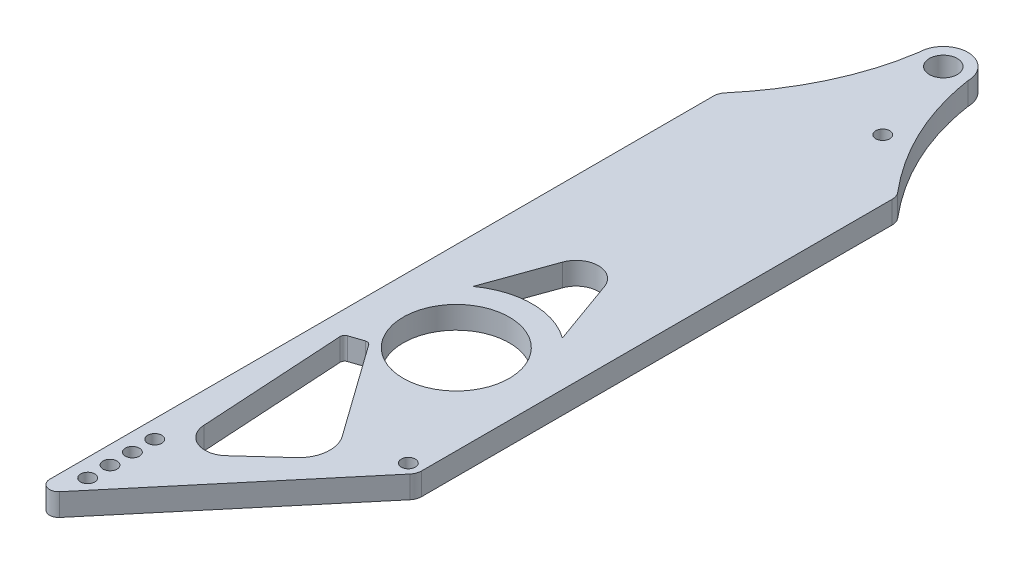
ISO-10303-21;
HEADER;
FILE_DESCRIPTION(('STEP AP214'),'2;1');
FILE_NAME('part.step','',(''),(''),'','','');
FILE_SCHEMA(('AUTOMOTIVE_DESIGN { 1 0 10303 214 1 1 1 1 }'));
ENDSEC;
DATA;
#1=APPLICATION_CONTEXT('core data for automotive mechanical design processes');
#2=APPLICATION_PROTOCOL_DEFINITION('international standard','automotive_design',2000,#1);
#3=PRODUCT_CONTEXT('',#1,'mechanical');
#4=PRODUCT('Part','Part','',(#3));
#5=PRODUCT_RELATED_PRODUCT_CATEGORY('part','',(#4));
#6=PRODUCT_DEFINITION_FORMATION('','',#4);
#7=PRODUCT_DEFINITION_CONTEXT('part definition',#1,'design');
#8=PRODUCT_DEFINITION('design','',#6,#7);
#9=PRODUCT_DEFINITION_SHAPE('','',#8);
#10=(LENGTH_UNIT() NAMED_UNIT(*) SI_UNIT(.MILLI.,.METRE.));
#11=(NAMED_UNIT(*) PLANE_ANGLE_UNIT() SI_UNIT($,.RADIAN.));
#12=(NAMED_UNIT(*) SI_UNIT($,.STERADIAN.) SOLID_ANGLE_UNIT());
#13=UNCERTAINTY_MEASURE_WITH_UNIT(LENGTH_MEASURE(1.E-05),#10,'distance_accuracy_value','');
#14=(GEOMETRIC_REPRESENTATION_CONTEXT(3) GLOBAL_UNCERTAINTY_ASSIGNED_CONTEXT((#13)) GLOBAL_UNIT_ASSIGNED_CONTEXT((#10,
#11,#12)) REPRESENTATION_CONTEXT('',''));
#15=CARTESIAN_POINT('',(0.,0.,0.));
#16=DIRECTION('',(0.,0.,1.));
#17=DIRECTION('',(1.,0.,0.));
#18=AXIS2_PLACEMENT_3D('',#15,#16,#17);
#19=CARTESIAN_POINT('',(-25.4,-6.35,228.6));
#20=DIRECTION('',(-1.,0.,0.));
#21=DIRECTION('',(0.,0.,1.));
#22=AXIS2_PLACEMENT_3D('',#19,#20,#21);
#23=PLANE('',#22);
#24=DIRECTION('',(0.,0.,1.));
#25=VECTOR('',#24,1.);
#26=CARTESIAN_POINT('',(-25.4,-6.35,228.6));
#27=LINE('',#26,#25);
#28=CARTESIAN_POINT('',(-25.4,-6.35,39.9267694135903));
#29=VERTEX_POINT('',#28);
#30=CARTESIAN_POINT('',(-25.4,-6.35,197.478592645415));
#31=VERTEX_POINT('',#30);
#32=EDGE_CURVE('E610',#29,#31,#27,.T.);
#33=ORIENTED_EDGE('',*,*,#32,.T.);
#34=DIRECTION('',(0.,1.,0.));
#35=VECTOR('',#34,1.);
#36=CARTESIAN_POINT('',(-25.4,-6.35,197.478592645415));
#37=LINE('',#36,#35);
#38=CARTESIAN_POINT('',(-25.4,0.,197.478592645415));
#39=VERTEX_POINT('',#38);
#40=EDGE_CURVE('E12',#31,#39,#37,.T.);
#41=ORIENTED_EDGE('',*,*,#40,.T.);
#42=DIRECTION('',(0.,0.,1.));
#43=VECTOR('',#42,1.);
#44=CARTESIAN_POINT('',(-25.4,0.,228.6));
#45=LINE('',#44,#43);
#46=CARTESIAN_POINT('',(-25.4,0.,39.9267694135903));
#47=VERTEX_POINT('',#46);
#48=EDGE_CURVE('E563',#47,#39,#45,.T.);
#49=ORIENTED_EDGE('',*,*,#48,.F.);
#50=DIRECTION('',(0.,1.,0.));
#51=VECTOR('',#50,1.);
#52=CARTESIAN_POINT('',(-25.4,-6.35,39.9267694135903));
#53=LINE('',#52,#51);
#54=EDGE_CURVE('E590',#29,#47,#53,.T.);
#55=ORIENTED_EDGE('',*,*,#54,.F.);
#56=EDGE_LOOP('',(#33,#41,#49,#55));
#57=FACE_BOUND('',#56,.T.);
#58=ADVANCED_FACE('F41',(#57),#23,.T.);
#59=CARTESIAN_POINT('',(24.5041153771793,-6.35,37.4723791494947));
#60=CARTESIAN_POINT('',(15.3630348655295,-6.35,26.6191079021656));
#61=CARTESIAN_POINT('',(9.17821142650546,-6.35,14.1999658167658));
#62=CARTESIAN_POINT('',(6.985,-6.35,0.));
#63=B_SPLINE_CURVE_WITH_KNOTS('',3,(#59,#60,#61,#62),.UNSPECIFIED.,.F.,.F.,(4,4),
(0.0317660676000999,1.),.UNSPECIFIED.);
#64=DIRECTION('',(0.,1.,0.));
#65=VECTOR('',#64,1.);
#66=SURFACE_OF_LINEAR_EXTRUSION('',#63,#65);
#67=CARTESIAN_POINT('',(24.5041153771793,0.,37.4723791494947));
#68=CARTESIAN_POINT('',(15.3630348655295,0.,26.6191079021656));
#69=CARTESIAN_POINT('',(9.17821142650546,0.,14.1999658167658));
#70=CARTESIAN_POINT('',(6.985,0.,0.));
#71=B_SPLINE_CURVE_WITH_KNOTS('',3,(#67,#68,#69,#70),.UNSPECIFIED.,.F.,.F.,(4,4),
(0.0317660676000999,1.),.UNSPECIFIED.);
#72=CARTESIAN_POINT('',(24.5041153771793,0.,37.4723791494947));
#73=VERTEX_POINT('',#72);
#74=CARTESIAN_POINT('',(6.985,0.,0.));
#75=VERTEX_POINT('',#74);
#76=EDGE_CURVE('E340',#73,#75,#71,.T.);
#77=ORIENTED_EDGE('',*,*,#76,.F.);
#78=DIRECTION('',(0.,1.,0.));
#79=VECTOR('',#78,1.);
#80=CARTESIAN_POINT('',(24.5041153771793,-6.35,37.4723791494947));
#81=LINE('',#80,#79);
#82=CARTESIAN_POINT('',(24.5041153771793,-6.35,37.4723791494947));
#83=VERTEX_POINT('',#82);
#84=EDGE_CURVE('E51',#83,#73,#81,.T.);
#85=ORIENTED_EDGE('',*,*,#84,.F.);
#86=CARTESIAN_POINT('',(6.985,-6.35,0.));
#87=VERTEX_POINT('',#86);
#88=EDGE_CURVE('E342',#83,#87,#63,.T.);
#89=ORIENTED_EDGE('',*,*,#88,.T.);
#90=DIRECTION('',(0.,1.,0.));
#91=VECTOR('',#90,1.);
#92=CARTESIAN_POINT('',(6.985,-6.35,0.));
#93=LINE('',#92,#91);
#94=EDGE_CURVE('E595',#87,#75,#93,.T.);
#95=ORIENTED_EDGE('',*,*,#94,.T.);
#96=EDGE_LOOP('',(#77,#85,#89,#95));
#97=FACE_BOUND('',#96,.T.);
#98=ADVANCED_FACE('F43',(#97),#66,.T.);
#99=CARTESIAN_POINT('',(21.59,-6.35,39.9267694135903));
#100=DIRECTION('',(0.,1.,0.));
#101=DIRECTION('',(0.,0.,1.));
#102=AXIS2_PLACEMENT_3D('',#99,#100,#101);
#103=CYLINDRICAL_SURFACE('',#102,3.81);
#104=CARTESIAN_POINT('',(21.59,0.,39.9267694135903));
#105=DIRECTION('',(0.,1.,0.));
#106=DIRECTION('',(0.,0.,-1.));
#107=AXIS2_PLACEMENT_3D('',#104,#105,#106);
#108=CIRCLE('',#107,3.81);
#109=CARTESIAN_POINT('',(25.4,0.,39.9267694135903));
#110=VERTEX_POINT('',#109);
#111=EDGE_CURVE('E349',#110,#73,#108,.T.);
#112=ORIENTED_EDGE('',*,*,#111,.F.);
#113=DIRECTION('',(0.,1.,0.));
#114=VECTOR('',#113,1.);
#115=CARTESIAN_POINT('',(25.4,-6.35,39.9267694135903));
#116=LINE('',#115,#114);
#117=CARTESIAN_POINT('',(25.4,-6.35,39.9267694135903));
#118=VERTEX_POINT('',#117);
#119=EDGE_CURVE('E579',#118,#110,#116,.T.);
#120=ORIENTED_EDGE('',*,*,#119,.F.);
#121=CARTESIAN_POINT('',(21.59,-6.35,39.9267694135903));
#122=DIRECTION('',(0.,1.,0.));
#123=DIRECTION('',(0.,0.,-1.));
#124=AXIS2_PLACEMENT_3D('',#121,#122,#123);
#125=CIRCLE('',#124,3.81);
#126=EDGE_CURVE('E547',#118,#83,#125,.T.);
#127=ORIENTED_EDGE('',*,*,#126,.T.);
#128=ORIENTED_EDGE('',*,*,#84,.T.);
#129=EDGE_LOOP('',(#112,#120,#127,#128));
#130=FACE_BOUND('',#129,.T.);
#131=ADVANCED_FACE('F388',(#130),#103,.T.);
#132=CARTESIAN_POINT('',(25.4,-6.35,39.9267694135903));
#133=DIRECTION('',(1.,0.,0.));
#134=DIRECTION('',(0.,0.,-1.));
#135=AXIS2_PLACEMENT_3D('',#132,#133,#134);
#136=PLANE('',#135);
#137=DIRECTION('',(0.,0.,-1.));
#138=VECTOR('',#137,1.);
#139=CARTESIAN_POINT('',(25.4,0.,39.9267694135903));
#140=LINE('',#139,#138);
#141=CARTESIAN_POINT('',(25.4,0.,173.650783549075));
#142=VERTEX_POINT('',#141);
#143=EDGE_CURVE('E575',#142,#110,#140,.T.);
#144=ORIENTED_EDGE('',*,*,#143,.F.);
#145=DIRECTION('',(0.,1.,0.));
#146=VECTOR('',#145,1.);
#147=CARTESIAN_POINT('',(25.4,-6.35,173.650783549075));
#148=LINE('',#147,#146);
#149=CARTESIAN_POINT('',(25.4,-6.35,173.650783549075));
#150=VERTEX_POINT('',#149);
#151=EDGE_CURVE('E581',#150,#142,#148,.T.);
#152=ORIENTED_EDGE('',*,*,#151,.F.);
#153=DIRECTION('',(0.,0.,-1.));
#154=VECTOR('',#153,1.);
#155=CARTESIAN_POINT('',(25.4,-6.35,39.9267694135903));
#156=LINE('',#155,#154);
#157=EDGE_CURVE('E597',#150,#118,#156,.T.);
#158=ORIENTED_EDGE('',*,*,#157,.T.);
#159=ORIENTED_EDGE('',*,*,#119,.T.);
#160=EDGE_LOOP('',(#144,#152,#158,#159));
#161=FACE_BOUND('',#160,.T.);
#162=ADVANCED_FACE('F410',(#161),#136,.T.);
#163=CARTESIAN_POINT('',(21.59,-6.35,173.650783549075));
#164=DIRECTION('',(0.,1.,0.));
#165=DIRECTION('',(0.,0.,1.));
#166=AXIS2_PLACEMENT_3D('',#163,#164,#165);
#167=CYLINDRICAL_SURFACE('',#166,3.81);
#168=CARTESIAN_POINT('',(21.59,0.,173.650783549075));
#169=DIRECTION('',(0.,1.,0.));
#170=DIRECTION('',(0.,0.,-1.));
#171=AXIS2_PLACEMENT_3D('',#168,#169,#170);
#172=CIRCLE('',#171,3.81);
#173=CARTESIAN_POINT('',(24.5086293282833,0.,176.09980434198));
#174=VERTEX_POINT('',#173);
#175=EDGE_CURVE('E572',#174,#142,#172,.T.);
#176=ORIENTED_EDGE('',*,*,#175,.F.);
#177=DIRECTION('',(0.,1.,0.));
#178=VECTOR('',#177,1.);
#179=CARTESIAN_POINT('',(24.5086293282833,-6.35,176.09980434198));
#180=LINE('',#179,#178);
#181=CARTESIAN_POINT('',(24.5086293282833,-6.35,176.09980434198));
#182=VERTEX_POINT('',#181);
#183=EDGE_CURVE('E583',#182,#174,#180,.T.);
#184=ORIENTED_EDGE('',*,*,#183,.F.);
#185=CARTESIAN_POINT('',(21.59,-6.35,173.650783549075));
#186=DIRECTION('',(0.,1.,0.));
#187=DIRECTION('',(0.,0.,-1.));
#188=AXIS2_PLACEMENT_3D('',#185,#186,#187);
#189=CIRCLE('',#188,3.81);
#190=EDGE_CURVE('E600',#182,#150,#189,.T.);
#191=ORIENTED_EDGE('',*,*,#190,.T.);
#192=ORIENTED_EDGE('',*,*,#151,.T.);
#193=EDGE_LOOP('',(#176,#184,#191,#192));
#194=FACE_BOUND('',#193,.T.);
#195=ADVANCED_FACE('F403',(#194),#167,.T.);
#196=CARTESIAN_POINT('',(24.5086293282833,-6.35,176.09980434198));
#197=DIRECTION('',(0.766044443118977,0.,0.64278760968654));
#198=DIRECTION('',(0.64278760968654,0.,-0.766044443118978));
#199=AXIS2_PLACEMENT_3D('',#196,#197,#198);
#200=PLANE('',#199);
#201=DIRECTION('',(0.64278760968654,0.,-0.766044443118977));
#202=VECTOR('',#201,1.);
#203=CARTESIAN_POINT('',(24.5086293282833,0.,176.09980434198));
#204=LINE('',#203,#202);
#205=CARTESIAN_POINT('',(-20.9142471144778,0.,230.232680528604));
#206=VERTEX_POINT('',#205);
#207=EDGE_CURVE('E569',#206,#174,#204,.T.);
#208=ORIENTED_EDGE('',*,*,#207,.F.);
#209=DIRECTION('',(0.,1.,0.));
#210=VECTOR('',#209,1.);
#211=CARTESIAN_POINT('',(-20.9142471144778,-6.35,230.232680528604));
#212=LINE('',#211,#210);
#213=CARTESIAN_POINT('',(-20.9142471144778,-6.35,230.232680528604));
#214=VERTEX_POINT('',#213);
#215=EDGE_CURVE('E585',#214,#206,#212,.T.);
#216=ORIENTED_EDGE('',*,*,#215,.F.);
#217=DIRECTION('',(0.64278760968654,0.,-0.766044443118977));
#218=VECTOR('',#217,1.);
#219=CARTESIAN_POINT('',(24.5086293282833,-6.35,176.09980434198));
#220=LINE('',#219,#218);
#221=EDGE_CURVE('E603',#214,#182,#220,.T.);
#222=ORIENTED_EDGE('',*,*,#221,.T.);
#223=ORIENTED_EDGE('',*,*,#183,.T.);
#224=EDGE_LOOP('',(#208,#216,#222,#223));
#225=FACE_BOUND('',#224,.T.);
#226=ADVANCED_FACE('F398',(#225),#200,.T.);
#227=CARTESIAN_POINT('',(-22.86,-6.35,228.6));
#228=DIRECTION('',(0.,1.,0.));
#229=DIRECTION('',(0.,0.,1.));
#230=AXIS2_PLACEMENT_3D('',#227,#228,#229);
#231=CYLINDRICAL_SURFACE('',#230,2.54000000000001);
#232=CARTESIAN_POINT('',(-22.86,0.,228.6));
#233=DIRECTION('',(0.,1.,0.));
#234=DIRECTION('',(0.,0.,1.));
#235=AXIS2_PLACEMENT_3D('',#232,#233,#234);
#236=CIRCLE('',#235,2.54000000000001);
#237=CARTESIAN_POINT('',(-25.4,0.,228.6));
#238=VERTEX_POINT('',#237);
#239=EDGE_CURVE('E566',#238,#206,#236,.T.);
#240=ORIENTED_EDGE('',*,*,#239,.F.);
#241=DIRECTION('',(0.,1.,0.));
#242=VECTOR('',#241,1.);
#243=CARTESIAN_POINT('',(-25.4,-6.35,228.6));
#244=LINE('',#243,#242);
#245=CARTESIAN_POINT('',(-25.4,-6.35,228.6));
#246=VERTEX_POINT('',#245);
#247=EDGE_CURVE('E587',#246,#238,#244,.T.);
#248=ORIENTED_EDGE('',*,*,#247,.F.);
#249=CARTESIAN_POINT('',(-22.86,-6.35,228.6));
#250=DIRECTION('',(0.,1.,0.));
#251=DIRECTION('',(0.,0.,1.));
#252=AXIS2_PLACEMENT_3D('',#249,#250,#251);
#253=CIRCLE('',#252,2.54000000000001);
#254=EDGE_CURVE('E608',#246,#214,#253,.T.);
#255=ORIENTED_EDGE('',*,*,#254,.T.);
#256=ORIENTED_EDGE('',*,*,#215,.T.);
#257=EDGE_LOOP('',(#240,#248,#255,#256));
#258=FACE_BOUND('',#257,.T.);
#259=ADVANCED_FACE('F392',(#258),#231,.T.);
#260=ORIENTED_EDGE('',*,*,#40,.F.);
#261=EDGE_CURVE('E611',#31,#246,#27,.T.);
#262=ORIENTED_EDGE('',*,*,#261,.T.);
#263=ORIENTED_EDGE('',*,*,#247,.T.);
#264=EDGE_CURVE('E562',#39,#238,#45,.T.);
#265=ORIENTED_EDGE('',*,*,#264,.F.);
#266=EDGE_LOOP('',(#260,#262,#263,#265));
#267=FACE_BOUND('',#266,.T.);
#268=ADVANCED_FACE('F384',(#267),#23,.T.);
#269=CARTESIAN_POINT('',(-21.59,-6.35,39.9267694135903));
#270=DIRECTION('',(0.,1.,0.));
#271=DIRECTION('',(0.,0.,1.));
#272=AXIS2_PLACEMENT_3D('',#269,#270,#271);
#273=CYLINDRICAL_SURFACE('',#272,3.81);
#274=CARTESIAN_POINT('',(-21.59,0.,39.9267694135903));
#275=DIRECTION('',(0.,1.,0.));
#276=DIRECTION('',(0.,0.,1.));
#277=AXIS2_PLACEMENT_3D('',#274,#275,#276);
#278=CIRCLE('',#277,3.81);
#279=CARTESIAN_POINT('',(-24.5041153771793,0.,37.4723791494947));
#280=VERTEX_POINT('',#279);
#281=EDGE_CURVE('E556',#280,#47,#278,.T.);
#282=ORIENTED_EDGE('',*,*,#281,.F.);
#283=DIRECTION('',(0.,1.,0.));
#284=VECTOR('',#283,1.);
#285=CARTESIAN_POINT('',(-24.5041153771793,-6.35,37.4723791494947));
#286=LINE('',#285,#284);
#287=CARTESIAN_POINT('',(-24.5041153771793,-6.35,37.4723791494947));
#288=VERTEX_POINT('',#287);
#289=EDGE_CURVE('E592',#288,#280,#286,.T.);
#290=ORIENTED_EDGE('',*,*,#289,.F.);
#291=CARTESIAN_POINT('',(-21.59,-6.35,39.9267694135903));
#292=DIRECTION('',(0.,1.,0.));
#293=DIRECTION('',(0.,0.,1.));
#294=AXIS2_PLACEMENT_3D('',#291,#292,#293);
#295=CIRCLE('',#294,3.81);
#296=EDGE_CURVE('E361',#288,#29,#295,.T.);
#297=ORIENTED_EDGE('',*,*,#296,.T.);
#298=ORIENTED_EDGE('',*,*,#54,.T.);
#299=EDGE_LOOP('',(#282,#290,#297,#298));
#300=FACE_BOUND('',#299,.T.);
#301=ADVANCED_FACE('F371',(#300),#273,.T.);
#302=CARTESIAN_POINT('',(-6.985,-6.35,0.));
#303=CARTESIAN_POINT('',(-9.14336989367859,-6.35,14.1044723053886));
#304=CARTESIAN_POINT('',(-15.3414644030369,-6.35,26.5934971354665));
#305=CARTESIAN_POINT('',(-24.5041153771793,-6.35,37.4723791494947));
#306=B_SPLINE_CURVE_WITH_KNOTS('',3,(#302,#303,#304,#305),.UNSPECIFIED.,.F.,.F.,(4,4),
(0.0310780985659568,1.),.UNSPECIFIED.);
#307=DIRECTION('',(0.,1.,0.));
#308=VECTOR('',#307,1.);
#309=SURFACE_OF_LINEAR_EXTRUSION('',#306,#308);
#310=CARTESIAN_POINT('',(-6.985,0.,0.));
#311=CARTESIAN_POINT('',(-9.14336989367859,0.,14.1044723053886));
#312=CARTESIAN_POINT('',(-15.3414644030369,0.,26.5934971354665));
#313=CARTESIAN_POINT('',(-24.5041153771793,0.,37.4723791494947));
#314=B_SPLINE_CURVE_WITH_KNOTS('',3,(#310,#311,#312,#313),.UNSPECIFIED.,.F.,.F.,(4,4),
(0.0310780985659568,1.),.UNSPECIFIED.);
#315=CARTESIAN_POINT('',(-6.985,0.,0.));
#316=VERTEX_POINT('',#315);
#317=EDGE_CURVE('E542',#316,#280,#314,.T.);
#318=ORIENTED_EDGE('',*,*,#317,.F.);
#319=DIRECTION('',(0.,1.,0.));
#320=VECTOR('',#319,1.);
#321=CARTESIAN_POINT('',(-6.985,-6.35,0.));
#322=LINE('',#321,#320);
#323=CARTESIAN_POINT('',(-6.985,-6.35,0.));
#324=VERTEX_POINT('',#323);
#325=EDGE_CURVE('E594',#324,#316,#322,.T.);
#326=ORIENTED_EDGE('',*,*,#325,.F.);
#327=EDGE_CURVE('E355',#324,#288,#306,.T.);
#328=ORIENTED_EDGE('',*,*,#327,.T.);
#329=ORIENTED_EDGE('',*,*,#289,.T.);
#330=EDGE_LOOP('',(#318,#326,#328,#329));
#331=FACE_BOUND('',#330,.T.);
#332=ADVANCED_FACE('F367',(#331),#309,.T.);
#333=CARTESIAN_POINT('',(0.,-6.35,0.));
#334=DIRECTION('',(0.,1.,0.));
#335=DIRECTION('',(0.,0.,1.));
#336=AXIS2_PLACEMENT_3D('',#333,#334,#335);
#337=CYLINDRICAL_SURFACE('',#336,6.985);
#338=CARTESIAN_POINT('',(0.,0.,0.));
#339=DIRECTION('',(0.,1.,0.));
#340=DIRECTION('',(0.,0.,1.));
#341=AXIS2_PLACEMENT_3D('',#338,#339,#340);
#342=CIRCLE('',#341,6.985);
#343=EDGE_CURVE('E538',#75,#316,#342,.T.);
#344=ORIENTED_EDGE('',*,*,#343,.F.);
#345=ORIENTED_EDGE('',*,*,#94,.F.);
#346=CARTESIAN_POINT('',(0.,-6.35,0.));
#347=DIRECTION('',(0.,1.,0.));
#348=DIRECTION('',(0.,0.,1.));
#349=AXIS2_PLACEMENT_3D('',#346,#347,#348);
#350=CIRCLE('',#349,6.985);
#351=EDGE_CURVE('E348',#87,#324,#350,.T.);
#352=ORIENTED_EDGE('',*,*,#351,.T.);
#353=ORIENTED_EDGE('',*,*,#325,.T.);
#354=EDGE_LOOP('',(#344,#345,#352,#353));
#355=FACE_BOUND('',#354,.T.);
#356=ADVANCED_FACE('F370',(#355),#337,.T.);
#357=CARTESIAN_POINT('',(13.1391067816605,-6.35,19.9912000382861));
#358=DIRECTION('',(0.,1.,0.));
#359=DIRECTION('',(0.,0.,1.));
#360=AXIS2_PLACEMENT_3D('',#357,#358,#359);
#361=PLANE('',#360);
#362=CARTESIAN_POINT('',(8.19455982965318,-6.35,25.4));
#363=DIRECTION('',(0.,1.,0.));
#364=DIRECTION('',(0.,0.,1.));
#365=AXIS2_PLACEMENT_3D('',#362,#363,#364);
#366=CIRCLE('',#365,2.);
#367=CARTESIAN_POINT('',(8.19455982965318,-6.35,27.4));
#368=VERTEX_POINT('',#367);
#369=EDGE_CURVE('E501',#368,#368,#366,.T.);
#370=ORIENTED_EDGE('',*,*,#369,.T.);
#371=EDGE_LOOP('',(#370));
#372=FACE_BOUND('',#371,.T.);
#373=CARTESIAN_POINT('',(21.59,-6.35,173.650783549075));
#374=DIRECTION('',(0.,1.,0.));
#375=DIRECTION('',(0.,0.,1.));
#376=AXIS2_PLACEMENT_3D('',#373,#374,#375);
#377=CIRCLE('',#376,2.);
#378=CARTESIAN_POINT('',(21.59,-6.35,175.650783549075));
#379=VERTEX_POINT('',#378);
#380=EDGE_CURVE('E233',#379,#379,#377,.T.);
#381=ORIENTED_EDGE('',*,*,#380,.T.);
#382=EDGE_LOOP('',(#381));
#383=FACE_BOUND('',#382,.T.);
#384=DIRECTION('',(-0.337872968267646,0.,0.941191721868616));
#385=VECTOR('',#384,1.);
#386=CARTESIAN_POINT('',(-12.7,-6.35,120.970386602218));
#387=LINE('',#386,#385);
#388=CARTESIAN_POINT('',(-5.97656743386571,-6.35,102.241338503956));
#389=VERTEX_POINT('',#388);
#390=CARTESIAN_POINT('',(-12.7,-6.35,120.970386602218));
#391=VERTEX_POINT('',#390);
#392=EDGE_CURVE('E207',#389,#391,#387,.T.);
#393=ORIENTED_EDGE('',*,*,#392,.T.);
#394=CARTESIAN_POINT('',(0.,-6.35,138.43));
#395=DIRECTION('',(0.,-1.,0.));
#396=DIRECTION('',(0.,0.,1.));
#397=AXIS2_PLACEMENT_3D('',#394,#395,#396);
#398=CIRCLE('',#397,21.59);
#399=CARTESIAN_POINT('',(12.7,-6.35,120.970386602218));
#400=VERTEX_POINT('',#399);
#401=EDGE_CURVE('E199',#391,#400,#398,.T.);
#402=ORIENTED_EDGE('',*,*,#401,.T.);
#403=DIRECTION('',(-0.337872968267646,0.,-0.941191721868616));
#404=VECTOR('',#403,1.);
#405=CARTESIAN_POINT('',(5.97656743386571,-6.35,102.241338503956));
#406=LINE('',#405,#404);
#407=CARTESIAN_POINT('',(5.97656743386571,-6.35,102.241338503956));
#408=VERTEX_POINT('',#407);
#409=EDGE_CURVE('E211',#400,#408,#406,.T.);
#410=ORIENTED_EDGE('',*,*,#409,.T.);
#411=CARTESIAN_POINT('',(0.,-6.35,104.386831852455));
#412=DIRECTION('',(0.,1.,0.));
#413=DIRECTION('',(0.,0.,-1.));
#414=AXIS2_PLACEMENT_3D('',#411,#412,#413);
#415=CIRCLE('',#414,6.35);
#416=EDGE_CURVE('E215',#408,#389,#415,.T.);
#417=ORIENTED_EDGE('',*,*,#416,.T.);
#418=EDGE_LOOP('',(#393,#402,#410,#417));
#419=FACE_BOUND('',#418,.T.);
#420=DIRECTION('',(0.0603044097444114,0.,0.998180032942644));
#421=VECTOR('',#420,1.);
#422=CARTESIAN_POINT('',(-16.7719367418102,-6.35,193.436924325686));
#423=LINE('',#422,#421);
#424=CARTESIAN_POINT('',(-19.2610100603779,-6.35,152.236897699857));
#425=VERTEX_POINT('',#424);
#426=CARTESIAN_POINT('',(-16.7719367418102,-6.35,193.436924325686));
#427=VERTEX_POINT('',#426);
#428=EDGE_CURVE('E265',#425,#427,#423,.T.);
#429=ORIENTED_EDGE('',*,*,#428,.T.);
#430=CARTESIAN_POINT('',(-10.4334935326244,-6.35,193.053991323809));
#431=DIRECTION('',(0.,1.,0.));
#432=DIRECTION('',(0.,0.,1.));
#433=AXIS2_PLACEMENT_3D('',#430,#431,#432);
#434=CIRCLE('',#433,6.34999999999999);
#435=CARTESIAN_POINT('',(-6.16182694745447,-6.35,197.752434106811));
#436=VERTEX_POINT('',#435);
#437=EDGE_CURVE('E243',#427,#436,#434,.T.);
#438=ORIENTED_EDGE('',*,*,#437,.T.);
#439=DIRECTION('',(0.739912249291642,0.,-0.672703399239355));
#440=VECTOR('',#439,1.);
#441=CARTESIAN_POINT('',(4.3502504745202,-6.35,188.195205906305));
#442=LINE('',#441,#440);
#443=CARTESIAN_POINT('',(4.35025047452023,-6.35,188.195205906305));
#444=VERTEX_POINT('',#443);
#445=EDGE_CURVE('E246',#436,#444,#442,.T.);
#446=ORIENTED_EDGE('',*,*,#445,.T.);
#447=CARTESIAN_POINT('',(-1.63008274471768,-6.35,181.617386010102));
#448=DIRECTION('',(0.,1.,0.));
#449=DIRECTION('',(0.,0.,1.));
#450=AXIS2_PLACEMENT_3D('',#447,#448,#449);
#451=CIRCLE('',#450,8.89000000000001);
#452=CARTESIAN_POINT('',(5.605496621933,-6.35,176.452263433735));
#453=VERTEX_POINT('',#452);
#454=EDGE_CURVE('E250',#444,#453,#451,.T.);
#455=ORIENTED_EDGE('',*,*,#454,.T.);
#456=DIRECTION('',(-0.581003664383274,0.,-0.813900941130558));
#457=VECTOR('',#456,1.);
#458=CARTESIAN_POINT('',(5.605496621933,-6.35,176.452263433735));
#459=LINE('',#458,#457);
#460=CARTESIAN_POINT('',(-13.1668795957275,-6.35,150.154916949649));
#461=VERTEX_POINT('',#460);
#462=EDGE_CURVE('E253',#453,#461,#459,.T.);
#463=ORIENTED_EDGE('',*,*,#462,.T.);
#464=CARTESIAN_POINT('',(-14.2005337909633,-6.35,150.892791603416));
#465=DIRECTION('',(0.,1.,0.));
#466=DIRECTION('',(0.,0.,-1.));
#467=AXIS2_PLACEMENT_3D('',#464,#465,#466);
#468=CIRCLE('',#467,1.26999999999997);
#469=CARTESIAN_POINT('',(-14.6030738457066,-6.35,149.688274478453));
#470=VERTEX_POINT('',#469);
#471=EDGE_CURVE('E256',#461,#470,#468,.T.);
#472=ORIENTED_EDGE('',*,*,#471,.T.);
#473=DIRECTION('',(-0.948438681072604,0.,0.316960673026258));
#474=VECTOR('',#473,1.);
#475=CARTESIAN_POINT('',(-18.3958614732841,-6.35,150.955793974519));
#476=LINE('',#475,#474);
#477=CARTESIAN_POINT('',(-18.3958614732841,-6.35,150.955793974519));
#478=VERTEX_POINT('',#477);
#479=EDGE_CURVE('E259',#470,#478,#476,.T.);
#480=ORIENTED_EDGE('',*,*,#479,.T.);
#481=CARTESIAN_POINT('',(-17.9933214185408,-6.35,152.160311099482));
#482=DIRECTION('',(0.,1.,0.));
#483=DIRECTION('',(0.,0.,1.));
#484=AXIS2_PLACEMENT_3D('',#481,#482,#483);
#485=CIRCLE('',#484,1.26999999999999);
#486=EDGE_CURVE('E262',#478,#425,#485,.T.);
#487=ORIENTED_EDGE('',*,*,#486,.T.);
#488=EDGE_LOOP('',(#429,#438,#446,#455,#463,#472,#480,#487));
#489=FACE_BOUND('',#488,.T.);
#490=CARTESIAN_POINT('',(-20.32,-6.35,203.828592645415));
#491=DIRECTION('',(0.,1.,0.));
#492=DIRECTION('',(0.,0.,1.));
#493=AXIS2_PLACEMENT_3D('',#490,#491,#492);
#494=CIRCLE('',#493,2.);
#495=CARTESIAN_POINT('',(-20.32,-6.35,205.828592645415));
#496=VERTEX_POINT('',#495);
#497=EDGE_CURVE('E307',#496,#496,#494,.T.);
#498=ORIENTED_EDGE('',*,*,#497,.T.);
#499=EDGE_LOOP('',(#498));
#500=FACE_BOUND('',#499,.T.);
#501=CARTESIAN_POINT('',(-20.32,-6.35,210.178592645415));
#502=DIRECTION('',(0.,1.,0.));
#503=DIRECTION('',(0.,0.,1.));
#504=AXIS2_PLACEMENT_3D('',#501,#502,#503);
#505=CIRCLE('',#504,2.);
#506=CARTESIAN_POINT('',(-20.32,-6.35,212.178592645415));
#507=VERTEX_POINT('',#506);
#508=EDGE_CURVE('E313',#507,#507,#505,.T.);
#509=ORIENTED_EDGE('',*,*,#508,.T.);
#510=EDGE_LOOP('',(#509));
#511=FACE_BOUND('',#510,.T.);
#512=CARTESIAN_POINT('',(-20.32,-6.35,222.878592645415));
#513=DIRECTION('',(0.,1.,0.));
#514=DIRECTION('',(0.,0.,1.));
#515=AXIS2_PLACEMENT_3D('',#512,#513,#514);
#516=CIRCLE('',#515,2.);
#517=CARTESIAN_POINT('',(-20.32,-6.35,224.878592645415));
#518=VERTEX_POINT('',#517);
#519=EDGE_CURVE('E319',#518,#518,#516,.T.);
#520=ORIENTED_EDGE('',*,*,#519,.T.);
#521=EDGE_LOOP('',(#520));
#522=FACE_BOUND('',#521,.T.);
#523=CARTESIAN_POINT('',(0.,-6.35,138.43));
#524=DIRECTION('',(0.,1.,0.));
#525=DIRECTION('',(0.,0.,1.));
#526=AXIS2_PLACEMENT_3D('',#523,#524,#525);
#527=CIRCLE('',#526,15.08125);
#528=CARTESIAN_POINT('',(0.,-6.35,153.51125));
#529=VERTEX_POINT('',#528);
#530=EDGE_CURVE('E325',#529,#529,#527,.T.);
#531=ORIENTED_EDGE('',*,*,#530,.T.);
#532=EDGE_LOOP('',(#531));
#533=FACE_BOUND('',#532,.T.);
#534=CARTESIAN_POINT('',(-20.32,-6.35,216.528592645415));
#535=DIRECTION('',(0.,1.,0.));
#536=DIRECTION('',(0.,0.,1.));
#537=AXIS2_PLACEMENT_3D('',#534,#535,#536);
#538=CIRCLE('',#537,2.);
#539=CARTESIAN_POINT('',(-20.32,-6.35,218.528592645415));
#540=VERTEX_POINT('',#539);
#541=EDGE_CURVE('E331',#540,#540,#538,.T.);
#542=ORIENTED_EDGE('',*,*,#541,.T.);
#543=EDGE_LOOP('',(#542));
#544=FACE_BOUND('',#543,.T.);
#545=CARTESIAN_POINT('',(0.,-6.35,0.));
#546=DIRECTION('',(0.,1.,0.));
#547=DIRECTION('',(0.,0.,1.));
#548=AXIS2_PLACEMENT_3D('',#545,#546,#547);
#549=CIRCLE('',#548,3.96875);
#550=CARTESIAN_POINT('',(0.,-6.35,3.96875));
#551=VERTEX_POINT('',#550);
#552=EDGE_CURVE('E337',#551,#551,#549,.T.);
#553=ORIENTED_EDGE('',*,*,#552,.T.);
#554=EDGE_LOOP('',(#553));
#555=FACE_BOUND('',#554,.T.);
#556=ORIENTED_EDGE('',*,*,#88,.F.);
#557=ORIENTED_EDGE('',*,*,#126,.F.);
#558=ORIENTED_EDGE('',*,*,#157,.F.);
#559=ORIENTED_EDGE('',*,*,#190,.F.);
#560=ORIENTED_EDGE('',*,*,#221,.F.);
#561=ORIENTED_EDGE('',*,*,#254,.F.);
#562=ORIENTED_EDGE('',*,*,#261,.F.);
#563=ORIENTED_EDGE('',*,*,#32,.F.);
#564=ORIENTED_EDGE('',*,*,#296,.F.);
#565=ORIENTED_EDGE('',*,*,#327,.F.);
#566=ORIENTED_EDGE('',*,*,#351,.F.);
#567=EDGE_LOOP('',(#556,#557,#558,#559,#560,#561,#562,#563,#564,#565,#566));
#568=FACE_BOUND('',#567,.T.);
#569=ADVANCED_FACE('F217',(#372,#383,#419,#489,#500,#511,#522,#533,#544,#555,#568),#361,.F.);
#570=CARTESIAN_POINT('',(13.1391067816605,0.,19.9912000382861));
#571=DIRECTION('',(0.,1.,0.));
#572=DIRECTION('',(0.,0.,1.));
#573=AXIS2_PLACEMENT_3D('',#570,#571,#572);
#574=PLANE('',#573);
#575=CARTESIAN_POINT('',(8.19455982965318,0.,25.4));
#576=DIRECTION('',(0.,1.,0.));
#577=DIRECTION('',(0.,0.,1.));
#578=AXIS2_PLACEMENT_3D('',#575,#576,#577);
#579=CIRCLE('',#578,2.);
#580=CARTESIAN_POINT('',(8.19455982965318,0.,27.4));
#581=VERTEX_POINT('',#580);
#582=EDGE_CURVE('E504',#581,#581,#579,.T.);
#583=ORIENTED_EDGE('',*,*,#582,.F.);
#584=EDGE_LOOP('',(#583));
#585=FACE_BOUND('',#584,.T.);
#586=CARTESIAN_POINT('',(21.59,0.,173.650783549075));
#587=DIRECTION('',(0.,1.,0.));
#588=DIRECTION('',(0.,0.,1.));
#589=AXIS2_PLACEMENT_3D('',#586,#587,#588);
#590=CIRCLE('',#589,2.);
#591=CARTESIAN_POINT('',(21.59,0.,175.650783549075));
#592=VERTEX_POINT('',#591);
#593=EDGE_CURVE('E226',#592,#592,#590,.T.);
#594=ORIENTED_EDGE('',*,*,#593,.F.);
#595=EDGE_LOOP('',(#594));
#596=FACE_BOUND('',#595,.T.);
#597=CARTESIAN_POINT('',(0.,0.,138.43));
#598=DIRECTION('',(0.,-1.,0.));
#599=DIRECTION('',(0.,0.,1.));
#600=AXIS2_PLACEMENT_3D('',#597,#598,#599);
#601=CIRCLE('',#600,21.59);
#602=CARTESIAN_POINT('',(-12.7,0.,120.970386602218));
#603=VERTEX_POINT('',#602);
#604=CARTESIAN_POINT('',(12.7,0.,120.970386602218));
#605=VERTEX_POINT('',#604);
#606=EDGE_CURVE('E202',#603,#605,#601,.T.);
#607=ORIENTED_EDGE('',*,*,#606,.F.);
#608=DIRECTION('',(-0.337872968267646,0.,0.941191721868616));
#609=VECTOR('',#608,1.);
#610=CARTESIAN_POINT('',(-12.7,0.,120.970386602218));
#611=LINE('',#610,#609);
#612=CARTESIAN_POINT('',(-5.97656743386571,0.,102.241338503956));
#613=VERTEX_POINT('',#612);
#614=EDGE_CURVE('E220',#613,#603,#611,.T.);
#615=ORIENTED_EDGE('',*,*,#614,.F.);
#616=CARTESIAN_POINT('',(0.,0.,104.386831852455));
#617=DIRECTION('',(0.,1.,0.));
#618=DIRECTION('',(0.,0.,-1.));
#619=AXIS2_PLACEMENT_3D('',#616,#617,#618);
#620=CIRCLE('',#619,6.35);
#621=CARTESIAN_POINT('',(5.97656743386571,0.,102.241338503956));
#622=VERTEX_POINT('',#621);
#623=EDGE_CURVE('E223',#622,#613,#620,.T.);
#624=ORIENTED_EDGE('',*,*,#623,.F.);
#625=DIRECTION('',(-0.337872968267646,0.,-0.941191721868616));
#626=VECTOR('',#625,1.);
#627=CARTESIAN_POINT('',(5.97656743386571,0.,102.241338503956));
#628=LINE('',#627,#626);
#629=EDGE_CURVE('E232',#605,#622,#628,.T.);
#630=ORIENTED_EDGE('',*,*,#629,.F.);
#631=EDGE_LOOP('',(#607,#615,#624,#630));
#632=FACE_BOUND('',#631,.T.);
#633=CARTESIAN_POINT('',(-10.4334935326244,0.,193.053991323809));
#634=DIRECTION('',(0.,1.,0.));
#635=DIRECTION('',(0.,0.,1.));
#636=AXIS2_PLACEMENT_3D('',#633,#634,#635);
#637=CIRCLE('',#636,6.34999999999999);
#638=CARTESIAN_POINT('',(-16.7719367418102,0.,193.436924325686));
#639=VERTEX_POINT('',#638);
#640=CARTESIAN_POINT('',(-6.16182694745444,0.,197.752434106811));
#641=VERTEX_POINT('',#640);
#642=EDGE_CURVE('E239',#639,#641,#637,.T.);
#643=ORIENTED_EDGE('',*,*,#642,.F.);
#644=DIRECTION('',(0.0603044097444114,0.,0.998180032942644));
#645=VECTOR('',#644,1.);
#646=CARTESIAN_POINT('',(-16.7719367418102,0.,193.436924325686));
#647=LINE('',#646,#645);
#648=CARTESIAN_POINT('',(-19.2610100603779,0.,152.236897699857));
#649=VERTEX_POINT('',#648);
#650=EDGE_CURVE('E247',#649,#639,#647,.T.);
#651=ORIENTED_EDGE('',*,*,#650,.F.);
#652=CARTESIAN_POINT('',(-17.9933214185408,0.,152.160311099482));
#653=DIRECTION('',(0.,1.,0.));
#654=DIRECTION('',(0.,0.,1.));
#655=AXIS2_PLACEMENT_3D('',#652,#653,#654);
#656=CIRCLE('',#655,1.26999999999999);
#657=CARTESIAN_POINT('',(-18.3958614732841,0.,150.955793974519));
#658=VERTEX_POINT('',#657);
#659=EDGE_CURVE('E285',#658,#649,#656,.T.);
#660=ORIENTED_EDGE('',*,*,#659,.F.);
#661=DIRECTION('',(-0.948438681072604,0.,0.316960673026258));
#662=VECTOR('',#661,1.);
#663=CARTESIAN_POINT('',(-18.3958614732841,0.,150.955793974519));
#664=LINE('',#663,#662);
#665=CARTESIAN_POINT('',(-14.6030738457066,0.,149.688274478453));
#666=VERTEX_POINT('',#665);
#667=EDGE_CURVE('E282',#666,#658,#664,.T.);
#668=ORIENTED_EDGE('',*,*,#667,.F.);
#669=CARTESIAN_POINT('',(-14.2005337909633,0.,150.892791603416));
#670=DIRECTION('',(0.,1.,0.));
#671=DIRECTION('',(0.,0.,-1.));
#672=AXIS2_PLACEMENT_3D('',#669,#670,#671);
#673=CIRCLE('',#672,1.26999999999997);
#674=CARTESIAN_POINT('',(-13.1668795957275,0.,150.154916949649));
#675=VERTEX_POINT('',#674);
#676=EDGE_CURVE('E279',#675,#666,#673,.T.);
#677=ORIENTED_EDGE('',*,*,#676,.F.);
#678=DIRECTION('',(-0.581003664383274,0.,-0.813900941130558));
#679=VECTOR('',#678,1.);
#680=CARTESIAN_POINT('',(5.605496621933,0.,176.452263433735));
#681=LINE('',#680,#679);
#682=CARTESIAN_POINT('',(5.605496621933,0.,176.452263433735));
#683=VERTEX_POINT('',#682);
#684=EDGE_CURVE('E276',#683,#675,#681,.T.);
#685=ORIENTED_EDGE('',*,*,#684,.F.);
#686=CARTESIAN_POINT('',(-1.63008274471768,0.,181.617386010102));
#687=DIRECTION('',(0.,1.,0.));
#688=DIRECTION('',(0.,0.,1.));
#689=AXIS2_PLACEMENT_3D('',#686,#687,#688);
#690=CIRCLE('',#689,8.89000000000001);
#691=CARTESIAN_POINT('',(4.35025047452021,0.,188.195205906305));
#692=VERTEX_POINT('',#691);
#693=EDGE_CURVE('E273',#692,#683,#690,.T.);
#694=ORIENTED_EDGE('',*,*,#693,.F.);
#695=DIRECTION('',(0.739912249291642,0.,-0.672703399239355));
#696=VECTOR('',#695,1.);
#697=CARTESIAN_POINT('',(4.3502504745202,0.,188.195205906305));
#698=LINE('',#697,#696);
#699=EDGE_CURVE('E270',#641,#692,#698,.T.);
#700=ORIENTED_EDGE('',*,*,#699,.F.);
#701=EDGE_LOOP('',(#643,#651,#660,#668,#677,#685,#694,#700));
#702=FACE_BOUND('',#701,.T.);
#703=CARTESIAN_POINT('',(-20.32,0.,203.828592645415));
#704=DIRECTION('',(0.,1.,0.));
#705=DIRECTION('',(0.,0.,1.));
#706=AXIS2_PLACEMENT_3D('',#703,#704,#705);
#707=CIRCLE('',#706,2.);
#708=CARTESIAN_POINT('',(-20.32,0.,205.828592645415));
#709=VERTEX_POINT('',#708);
#710=EDGE_CURVE('E292',#709,#709,#707,.T.);
#711=ORIENTED_EDGE('',*,*,#710,.F.);
#712=EDGE_LOOP('',(#711));
#713=FACE_BOUND('',#712,.T.);
#714=CARTESIAN_POINT('',(-20.32,0.,210.178592645415));
#715=DIRECTION('',(0.,1.,0.));
#716=DIRECTION('',(0.,0.,1.));
#717=AXIS2_PLACEMENT_3D('',#714,#715,#716);
#718=CIRCLE('',#717,2.);
#719=CARTESIAN_POINT('',(-20.32,0.,212.178592645415));
#720=VERTEX_POINT('',#719);
#721=EDGE_CURVE('E310',#720,#720,#718,.T.);
#722=ORIENTED_EDGE('',*,*,#721,.F.);
#723=EDGE_LOOP('',(#722));
#724=FACE_BOUND('',#723,.T.);
#725=CARTESIAN_POINT('',(-20.32,0.,222.878592645415));
#726=DIRECTION('',(0.,1.,0.));
#727=DIRECTION('',(0.,0.,1.));
#728=AXIS2_PLACEMENT_3D('',#725,#726,#727);
#729=CIRCLE('',#728,2.);
#730=CARTESIAN_POINT('',(-20.32,0.,224.878592645415));
#731=VERTEX_POINT('',#730);
#732=EDGE_CURVE('E316',#731,#731,#729,.T.);
#733=ORIENTED_EDGE('',*,*,#732,.F.);
#734=EDGE_LOOP('',(#733));
#735=FACE_BOUND('',#734,.T.);
#736=CARTESIAN_POINT('',(0.,0.,138.43));
#737=DIRECTION('',(0.,1.,0.));
#738=DIRECTION('',(0.,0.,1.));
#739=AXIS2_PLACEMENT_3D('',#736,#737,#738);
#740=CIRCLE('',#739,15.08125);
#741=CARTESIAN_POINT('',(0.,0.,153.51125));
#742=VERTEX_POINT('',#741);
#743=EDGE_CURVE('E322',#742,#742,#740,.T.);
#744=ORIENTED_EDGE('',*,*,#743,.F.);
#745=EDGE_LOOP('',(#744));
#746=FACE_BOUND('',#745,.T.);
#747=CARTESIAN_POINT('',(-20.32,0.,216.528592645415));
#748=DIRECTION('',(0.,1.,0.));
#749=DIRECTION('',(0.,0.,1.));
#750=AXIS2_PLACEMENT_3D('',#747,#748,#749);
#751=CIRCLE('',#750,2.);
#752=CARTESIAN_POINT('',(-20.32,0.,218.528592645415));
#753=VERTEX_POINT('',#752);
#754=EDGE_CURVE('E328',#753,#753,#751,.T.);
#755=ORIENTED_EDGE('',*,*,#754,.F.);
#756=EDGE_LOOP('',(#755));
#757=FACE_BOUND('',#756,.T.);
#758=CARTESIAN_POINT('',(0.,0.,0.));
#759=DIRECTION('',(0.,1.,0.));
#760=DIRECTION('',(0.,0.,1.));
#761=AXIS2_PLACEMENT_3D('',#758,#759,#760);
#762=CIRCLE('',#761,3.96875);
#763=CARTESIAN_POINT('',(0.,0.,3.96875));
#764=VERTEX_POINT('',#763);
#765=EDGE_CURVE('E334',#764,#764,#762,.T.);
#766=ORIENTED_EDGE('',*,*,#765,.F.);
#767=EDGE_LOOP('',(#766));
#768=FACE_BOUND('',#767,.T.);
#769=ORIENTED_EDGE('',*,*,#76,.T.);
#770=ORIENTED_EDGE('',*,*,#343,.T.);
#771=ORIENTED_EDGE('',*,*,#317,.T.);
#772=ORIENTED_EDGE('',*,*,#281,.T.);
#773=ORIENTED_EDGE('',*,*,#48,.T.);
#774=ORIENTED_EDGE('',*,*,#264,.T.);
#775=ORIENTED_EDGE('',*,*,#239,.T.);
#776=ORIENTED_EDGE('',*,*,#207,.T.);
#777=ORIENTED_EDGE('',*,*,#175,.T.);
#778=ORIENTED_EDGE('',*,*,#143,.T.);
#779=ORIENTED_EDGE('',*,*,#111,.T.);
#780=EDGE_LOOP('',(#769,#770,#771,#772,#773,#774,#775,#776,#777,#778,#779));
#781=FACE_BOUND('',#780,.T.);
#782=ADVANCED_FACE('F379',(#585,#596,#632,#702,#713,#724,#735,#746,#757,#768,#781),#574,.T.);
#783=CARTESIAN_POINT('',(0.,-6.35,0.));
#784=DIRECTION('',(0.,1.,0.));
#785=DIRECTION('',(0.,0.,1.));
#786=AXIS2_PLACEMENT_3D('',#783,#784,#785);
#787=CYLINDRICAL_SURFACE('',#786,3.96875);
#788=ORIENTED_EDGE('',*,*,#552,.F.);
#789=EDGE_LOOP('',(#788));
#790=FACE_BOUND('',#789,.T.);
#791=ORIENTED_EDGE('',*,*,#765,.T.);
#792=EDGE_LOOP('',(#791));
#793=FACE_BOUND('',#792,.T.);
#794=ADVANCED_FACE('F419',(#790,#793),#787,.F.);
#795=CARTESIAN_POINT('',(-20.32,-6.35,216.528592645415));
#796=DIRECTION('',(0.,1.,0.));
#797=DIRECTION('',(0.,0.,1.));
#798=AXIS2_PLACEMENT_3D('',#795,#796,#797);
#799=CYLINDRICAL_SURFACE('',#798,2.);
#800=ORIENTED_EDGE('',*,*,#541,.F.);
#801=EDGE_LOOP('',(#800));
#802=FACE_BOUND('',#801,.T.);
#803=ORIENTED_EDGE('',*,*,#754,.T.);
#804=EDGE_LOOP('',(#803));
#805=FACE_BOUND('',#804,.T.);
#806=ADVANCED_FACE('F424',(#802,#805),#799,.F.);
#807=CARTESIAN_POINT('',(0.,-6.35,138.43));
#808=DIRECTION('',(0.,1.,0.));
#809=DIRECTION('',(0.,0.,1.));
#810=AXIS2_PLACEMENT_3D('',#807,#808,#809);
#811=CYLINDRICAL_SURFACE('',#810,15.08125);
#812=ORIENTED_EDGE('',*,*,#530,.F.);
#813=EDGE_LOOP('',(#812));
#814=FACE_BOUND('',#813,.T.);
#815=ORIENTED_EDGE('',*,*,#743,.T.);
#816=EDGE_LOOP('',(#815));
#817=FACE_BOUND('',#816,.T.);
#818=ADVANCED_FACE('F428',(#814,#817),#811,.F.);
#819=CARTESIAN_POINT('',(-20.32,-6.35,222.878592645415));
#820=DIRECTION('',(0.,1.,0.));
#821=DIRECTION('',(0.,0.,1.));
#822=AXIS2_PLACEMENT_3D('',#819,#820,#821);
#823=CYLINDRICAL_SURFACE('',#822,2.);
#824=ORIENTED_EDGE('',*,*,#519,.F.);
#825=EDGE_LOOP('',(#824));
#826=FACE_BOUND('',#825,.T.);
#827=ORIENTED_EDGE('',*,*,#732,.T.);
#828=EDGE_LOOP('',(#827));
#829=FACE_BOUND('',#828,.T.);
#830=ADVANCED_FACE('F432',(#826,#829),#823,.F.);
#831=CARTESIAN_POINT('',(-20.32,-6.35,210.178592645415));
#832=DIRECTION('',(0.,1.,0.));
#833=DIRECTION('',(0.,0.,1.));
#834=AXIS2_PLACEMENT_3D('',#831,#832,#833);
#835=CYLINDRICAL_SURFACE('',#834,2.);
#836=ORIENTED_EDGE('',*,*,#508,.F.);
#837=EDGE_LOOP('',(#836));
#838=FACE_BOUND('',#837,.T.);
#839=ORIENTED_EDGE('',*,*,#721,.T.);
#840=EDGE_LOOP('',(#839));
#841=FACE_BOUND('',#840,.T.);
#842=ADVANCED_FACE('F436',(#838,#841),#835,.F.);
#843=CARTESIAN_POINT('',(-20.32,-6.35,203.828592645415));
#844=DIRECTION('',(0.,1.,0.));
#845=DIRECTION('',(0.,0.,1.));
#846=AXIS2_PLACEMENT_3D('',#843,#844,#845);
#847=CYLINDRICAL_SURFACE('',#846,2.);
#848=ORIENTED_EDGE('',*,*,#497,.F.);
#849=EDGE_LOOP('',(#848));
#850=FACE_BOUND('',#849,.T.);
#851=ORIENTED_EDGE('',*,*,#710,.T.);
#852=EDGE_LOOP('',(#851));
#853=FACE_BOUND('',#852,.T.);
#854=ADVANCED_FACE('F440',(#850,#853),#847,.F.);
#855=CARTESIAN_POINT('',(-10.4334935326244,-6.35,193.053991323809));
#856=DIRECTION('',(0.,1.,0.));
#857=DIRECTION('',(0.,0.,1.));
#858=AXIS2_PLACEMENT_3D('',#855,#856,#857);
#859=CYLINDRICAL_SURFACE('',#858,6.34999999999999);
#860=ORIENTED_EDGE('',*,*,#642,.T.);
#861=DIRECTION('',(0.,1.,0.));
#862=VECTOR('',#861,1.);
#863=CARTESIAN_POINT('',(-6.16182694745447,-6.35,197.752434106811));
#864=LINE('',#863,#862);
#865=EDGE_CURVE('E268',#436,#641,#864,.T.);
#866=ORIENTED_EDGE('',*,*,#865,.F.);
#867=ORIENTED_EDGE('',*,*,#437,.F.);
#868=DIRECTION('',(0.,1.,0.));
#869=VECTOR('',#868,1.);
#870=CARTESIAN_POINT('',(-16.7719367418102,-6.35,193.436924325686));
#871=LINE('',#870,#869);
#872=EDGE_CURVE('E290',#427,#639,#871,.T.);
#873=ORIENTED_EDGE('',*,*,#872,.T.);
#874=EDGE_LOOP('',(#860,#866,#867,#873));
#875=FACE_BOUND('',#874,.T.);
#876=ADVANCED_FACE('F444',(#875),#859,.F.);
#877=CARTESIAN_POINT('',(-16.7719367418102,-6.35,193.436924325686));
#878=DIRECTION('',(-0.998180032942644,0.,0.0603044097444114));
#879=DIRECTION('',(0.0603044097444114,0.,0.998180032942644));
#880=AXIS2_PLACEMENT_3D('',#877,#878,#879);
#881=PLANE('',#880);
#882=ORIENTED_EDGE('',*,*,#650,.T.);
#883=ORIENTED_EDGE('',*,*,#872,.F.);
#884=ORIENTED_EDGE('',*,*,#428,.F.);
#885=DIRECTION('',(0.,1.,0.));
#886=VECTOR('',#885,1.);
#887=CARTESIAN_POINT('',(-19.2610100603779,-6.35,152.236897699857));
#888=LINE('',#887,#886);
#889=EDGE_CURVE('E293',#425,#649,#888,.T.);
#890=ORIENTED_EDGE('',*,*,#889,.T.);
#891=EDGE_LOOP('',(#882,#883,#884,#890));
#892=FACE_BOUND('',#891,.T.);
#893=ADVANCED_FACE('F448',(#892),#881,.F.);
#894=CARTESIAN_POINT('',(-17.9933214185408,-6.35,152.160311099482));
#895=DIRECTION('',(0.,1.,0.));
#896=DIRECTION('',(0.,0.,1.));
#897=AXIS2_PLACEMENT_3D('',#894,#895,#896);
#898=CYLINDRICAL_SURFACE('',#897,1.26999999999999);
#899=ORIENTED_EDGE('',*,*,#659,.T.);
#900=ORIENTED_EDGE('',*,*,#889,.F.);
#901=ORIENTED_EDGE('',*,*,#486,.F.);
#902=DIRECTION('',(0.,1.,0.));
#903=VECTOR('',#902,1.);
#904=CARTESIAN_POINT('',(-18.3958614732841,-6.35,150.955793974519));
#905=LINE('',#904,#903);
#906=EDGE_CURVE('E295',#478,#658,#905,.T.);
#907=ORIENTED_EDGE('',*,*,#906,.T.);
#908=EDGE_LOOP('',(#899,#900,#901,#907));
#909=FACE_BOUND('',#908,.T.);
#910=ADVANCED_FACE('F469',(#909),#898,.F.);
#911=CARTESIAN_POINT('',(-18.3958614732841,-6.35,150.955793974519));
#912=DIRECTION('',(-0.316960673026258,0.,-0.948438681072604));
#913=DIRECTION('',(-0.948438681072605,0.,0.316960673026258));
#914=AXIS2_PLACEMENT_3D('',#911,#912,#913);
#915=PLANE('',#914);
#916=ORIENTED_EDGE('',*,*,#667,.T.);
#917=ORIENTED_EDGE('',*,*,#906,.F.);
#918=ORIENTED_EDGE('',*,*,#479,.F.);
#919=DIRECTION('',(0.,1.,0.));
#920=VECTOR('',#919,1.);
#921=CARTESIAN_POINT('',(-14.6030738457066,-6.35,149.688274478453));
#922=LINE('',#921,#920);
#923=EDGE_CURVE('E297',#470,#666,#922,.T.);
#924=ORIENTED_EDGE('',*,*,#923,.T.);
#925=EDGE_LOOP('',(#916,#917,#918,#924));
#926=FACE_BOUND('',#925,.T.);
#927=ADVANCED_FACE('F465',(#926),#915,.F.);
#928=CARTESIAN_POINT('',(-14.2005337909633,-6.35,150.892791603416));
#929=DIRECTION('',(0.,1.,0.));
#930=DIRECTION('',(0.,0.,1.));
#931=AXIS2_PLACEMENT_3D('',#928,#929,#930);
#932=CYLINDRICAL_SURFACE('',#931,1.26999999999997);
#933=ORIENTED_EDGE('',*,*,#676,.T.);
#934=ORIENTED_EDGE('',*,*,#923,.F.);
#935=ORIENTED_EDGE('',*,*,#471,.F.);
#936=DIRECTION('',(0.,1.,0.));
#937=VECTOR('',#936,1.);
#938=CARTESIAN_POINT('',(-13.1668795957275,-6.35,150.154916949649));
#939=LINE('',#938,#937);
#940=EDGE_CURVE('E299',#461,#675,#939,.T.);
#941=ORIENTED_EDGE('',*,*,#940,.T.);
#942=EDGE_LOOP('',(#933,#934,#935,#941));
#943=FACE_BOUND('',#942,.T.);
#944=ADVANCED_FACE('F461',(#943),#932,.F.);
#945=CARTESIAN_POINT('',(5.605496621933,-6.35,176.452263433735));
#946=DIRECTION('',(0.813900941130558,0.,-0.581003664383274));
#947=DIRECTION('',(-0.581003664383274,0.,-0.813900941130558));
#948=AXIS2_PLACEMENT_3D('',#945,#946,#947);
#949=PLANE('',#948);
#950=ORIENTED_EDGE('',*,*,#684,.T.);
#951=ORIENTED_EDGE('',*,*,#940,.F.);
#952=ORIENTED_EDGE('',*,*,#462,.F.);
#953=DIRECTION('',(0.,1.,0.));
#954=VECTOR('',#953,1.);
#955=CARTESIAN_POINT('',(5.605496621933,-6.35,176.452263433735));
#956=LINE('',#955,#954);
#957=EDGE_CURVE('E301',#453,#683,#956,.T.);
#958=ORIENTED_EDGE('',*,*,#957,.T.);
#959=EDGE_LOOP('',(#950,#951,#952,#958));
#960=FACE_BOUND('',#959,.T.);
#961=ADVANCED_FACE('F457',(#960),#949,.F.);
#962=CARTESIAN_POINT('',(-1.63008274471768,-6.35,181.617386010102));
#963=DIRECTION('',(0.,1.,0.));
#964=DIRECTION('',(0.,0.,1.));
#965=AXIS2_PLACEMENT_3D('',#962,#963,#964);
#966=CYLINDRICAL_SURFACE('',#965,8.89000000000001);
#967=ORIENTED_EDGE('',*,*,#693,.T.);
#968=ORIENTED_EDGE('',*,*,#957,.F.);
#969=ORIENTED_EDGE('',*,*,#454,.F.);
#970=DIRECTION('',(0.,1.,0.));
#971=VECTOR('',#970,1.);
#972=CARTESIAN_POINT('',(4.35025047452021,-6.35,188.195205906305));
#973=LINE('',#972,#971);
#974=EDGE_CURVE('E303',#444,#692,#973,.T.);
#975=ORIENTED_EDGE('',*,*,#974,.T.);
#976=EDGE_LOOP('',(#967,#968,#969,#975));
#977=FACE_BOUND('',#976,.T.);
#978=ADVANCED_FACE('F453',(#977),#966,.F.);
#979=CARTESIAN_POINT('',(4.3502504745202,-6.35,188.195205906305));
#980=DIRECTION('',(0.672703399239355,0.,0.739912249291641));
#981=DIRECTION('',(0.739912249291642,0.,-0.672703399239356));
#982=AXIS2_PLACEMENT_3D('',#979,#980,#981);
#983=PLANE('',#982);
#984=ORIENTED_EDGE('',*,*,#699,.T.);
#985=ORIENTED_EDGE('',*,*,#974,.F.);
#986=ORIENTED_EDGE('',*,*,#445,.F.);
#987=ORIENTED_EDGE('',*,*,#865,.T.);
#988=EDGE_LOOP('',(#984,#985,#986,#987));
#989=FACE_BOUND('',#988,.T.);
#990=ADVANCED_FACE('F450',(#989),#983,.F.);
#991=CARTESIAN_POINT('',(0.,-6.35,138.43));
#992=DIRECTION('',(0.,1.,0.));
#993=DIRECTION('',(0.,0.,1.));
#994=AXIS2_PLACEMENT_3D('',#991,#992,#993);
#995=CYLINDRICAL_SURFACE('',#994,21.59);
#996=ORIENTED_EDGE('',*,*,#606,.T.);
#997=DIRECTION('',(0.,1.,0.));
#998=VECTOR('',#997,1.);
#999=CARTESIAN_POINT('',(12.7,-6.35,120.970386602218));
#1000=LINE('',#999,#998);
#1001=EDGE_CURVE('E195',#400,#605,#1000,.T.);
#1002=ORIENTED_EDGE('',*,*,#1001,.F.);
#1003=ORIENTED_EDGE('',*,*,#401,.F.);
#1004=DIRECTION('',(0.,1.,0.));
#1005=VECTOR('',#1004,1.);
#1006=CARTESIAN_POINT('',(-12.7,-6.35,120.970386602218));
#1007=LINE('',#1006,#1005);
#1008=EDGE_CURVE('E237',#391,#603,#1007,.T.);
#1009=ORIENTED_EDGE('',*,*,#1008,.T.);
#1010=EDGE_LOOP('',(#996,#1002,#1003,#1009));
#1011=FACE_BOUND('',#1010,.T.);
#1012=ADVANCED_FACE('F197',(#1011),#995,.T.);
#1013=CARTESIAN_POINT('',(-12.7,-6.35,120.970386602218));
#1014=DIRECTION('',(-0.941191721868616,0.,-0.337872968267646));
#1015=DIRECTION('',(-0.337872968267646,0.,0.941191721868616));
#1016=AXIS2_PLACEMENT_3D('',#1013,#1014,#1015);
#1017=PLANE('',#1016);
#1018=ORIENTED_EDGE('',*,*,#614,.T.);
#1019=ORIENTED_EDGE('',*,*,#1008,.F.);
#1020=ORIENTED_EDGE('',*,*,#392,.F.);
#1021=DIRECTION('',(0.,1.,0.));
#1022=VECTOR('',#1021,1.);
#1023=CARTESIAN_POINT('',(-5.97656743386571,-6.35,102.241338503956));
#1024=LINE('',#1023,#1022);
#1025=EDGE_CURVE('E240',#389,#613,#1024,.T.);
#1026=ORIENTED_EDGE('',*,*,#1025,.T.);
#1027=EDGE_LOOP('',(#1018,#1019,#1020,#1026));
#1028=FACE_BOUND('',#1027,.T.);
#1029=ADVANCED_FACE('F479',(#1028),#1017,.F.);
#1030=CARTESIAN_POINT('',(0.,-6.35,104.386831852455));
#1031=DIRECTION('',(0.,1.,0.));
#1032=DIRECTION('',(0.,0.,1.));
#1033=AXIS2_PLACEMENT_3D('',#1030,#1031,#1032);
#1034=CYLINDRICAL_SURFACE('',#1033,6.35);
#1035=ORIENTED_EDGE('',*,*,#623,.T.);
#1036=ORIENTED_EDGE('',*,*,#1025,.F.);
#1037=ORIENTED_EDGE('',*,*,#416,.F.);
#1038=DIRECTION('',(0.,1.,0.));
#1039=VECTOR('',#1038,1.);
#1040=CARTESIAN_POINT('',(5.97656743386571,-6.35,102.241338503956));
#1041=LINE('',#1040,#1039);
#1042=EDGE_CURVE('E206',#408,#622,#1041,.T.);
#1043=ORIENTED_EDGE('',*,*,#1042,.T.);
#1044=EDGE_LOOP('',(#1035,#1036,#1037,#1043));
#1045=FACE_BOUND('',#1044,.T.);
#1046=ADVANCED_FACE('F483',(#1045),#1034,.F.);
#1047=CARTESIAN_POINT('',(5.97656743386571,-6.35,102.241338503956));
#1048=DIRECTION('',(0.941191721868616,0.,-0.337872968267646));
#1049=DIRECTION('',(-0.337872968267646,0.,-0.941191721868616));
#1050=AXIS2_PLACEMENT_3D('',#1047,#1048,#1049);
#1051=PLANE('',#1050);
#1052=ORIENTED_EDGE('',*,*,#629,.T.);
#1053=ORIENTED_EDGE('',*,*,#1042,.F.);
#1054=ORIENTED_EDGE('',*,*,#409,.F.);
#1055=ORIENTED_EDGE('',*,*,#1001,.T.);
#1056=EDGE_LOOP('',(#1052,#1053,#1054,#1055));
#1057=FACE_BOUND('',#1056,.T.);
#1058=ADVANCED_FACE('F212',(#1057),#1051,.F.);
#1059=CARTESIAN_POINT('',(21.59,-6.35,173.650783549075));
#1060=DIRECTION('',(0.,1.,0.));
#1061=DIRECTION('',(0.,0.,1.));
#1062=AXIS2_PLACEMENT_3D('',#1059,#1060,#1061);
#1063=CYLINDRICAL_SURFACE('',#1062,2.);
#1064=ORIENTED_EDGE('',*,*,#380,.F.);
#1065=EDGE_LOOP('',(#1064));
#1066=FACE_BOUND('',#1065,.T.);
#1067=ORIENTED_EDGE('',*,*,#593,.T.);
#1068=EDGE_LOOP('',(#1067));
#1069=FACE_BOUND('',#1068,.T.);
#1070=ADVANCED_FACE('F482',(#1066,#1069),#1063,.F.);
#1071=CARTESIAN_POINT('',(8.19455982965318,-6.35,25.4));
#1072=DIRECTION('',(0.,1.,0.));
#1073=DIRECTION('',(0.,0.,1.));
#1074=AXIS2_PLACEMENT_3D('',#1071,#1072,#1073);
#1075=CYLINDRICAL_SURFACE('',#1074,2.);
#1076=ORIENTED_EDGE('',*,*,#369,.F.);
#1077=EDGE_LOOP('',(#1076));
#1078=FACE_BOUND('',#1077,.T.);
#1079=ORIENTED_EDGE('',*,*,#582,.T.);
#1080=EDGE_LOOP('',(#1079));
#1081=FACE_BOUND('',#1080,.T.);
#1082=ADVANCED_FACE('F492',(#1078,#1081),#1075,.F.);
#1083=CLOSED_SHELL('',(#58,#98,#131,#162,#195,#226,#259,#268,#301,#332,#356,#569,#782,#794,#806,
#818,#830,#842,#854,#876,#893,#910,#927,#944,#961,#978,#990,#1012,#1029,#1046,#1058,#1070,#1082));
#1084=MANIFOLD_SOLID_BREP('B2',#1083);
#1085=ADVANCED_BREP_SHAPE_REPRESENTATION('',(#18,#1084),#14);
#1086=SHAPE_DEFINITION_REPRESENTATION(#9,#1085);
ENDSEC;
END-ISO-10303-21;
